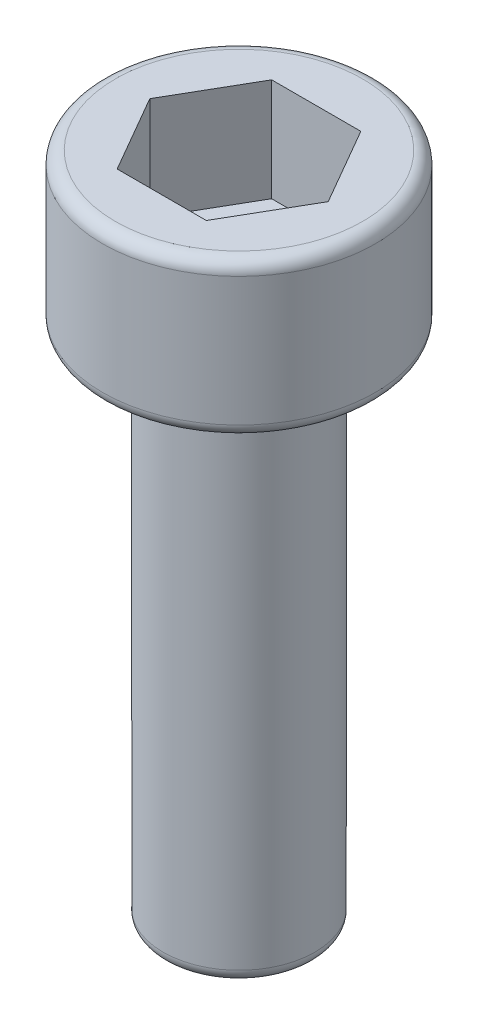
ISO-10303-21;
HEADER;
FILE_DESCRIPTION(('STEP AP214'),'2;1');
FILE_NAME('part.step','',(''),(''),'','','');
FILE_SCHEMA(('AUTOMOTIVE_DESIGN { 1 0 10303 214 1 1 1 1 }'));
ENDSEC;
DATA;
#1=APPLICATION_CONTEXT('core data for automotive mechanical design processes');
#2=APPLICATION_PROTOCOL_DEFINITION('international standard','automotive_design',2000,#1);
#3=PRODUCT_CONTEXT('',#1,'mechanical');
#4=PRODUCT('Part','Part','',(#3));
#5=PRODUCT_RELATED_PRODUCT_CATEGORY('part','',(#4));
#6=PRODUCT_DEFINITION_FORMATION('','',#4);
#7=PRODUCT_DEFINITION_CONTEXT('part definition',#1,'design');
#8=PRODUCT_DEFINITION('design','',#6,#7);
#9=PRODUCT_DEFINITION_SHAPE('','',#8);
#10=(LENGTH_UNIT() NAMED_UNIT(*) SI_UNIT(.MILLI.,.METRE.));
#11=(NAMED_UNIT(*) PLANE_ANGLE_UNIT() SI_UNIT($,.RADIAN.));
#12=(NAMED_UNIT(*) SI_UNIT($,.STERADIAN.) SOLID_ANGLE_UNIT());
#13=UNCERTAINTY_MEASURE_WITH_UNIT(LENGTH_MEASURE(1.E-05),#10,'distance_accuracy_value','');
#14=(GEOMETRIC_REPRESENTATION_CONTEXT(3) GLOBAL_UNCERTAINTY_ASSIGNED_CONTEXT((#13)) GLOBAL_UNIT_ASSIGNED_CONTEXT((#10,
#11,#12)) REPRESENTATION_CONTEXT('',''));
#15=CARTESIAN_POINT('',(0.,0.,0.));
#16=DIRECTION('',(0.,0.,1.));
#17=DIRECTION('',(1.,0.,0.));
#18=AXIS2_PLACEMENT_3D('',#15,#16,#17);
#19=CARTESIAN_POINT('',(0.,3.,0.));
#20=DIRECTION('',(0.,-1.,0.));
#21=DIRECTION('',(0.,0.,-1.));
#22=AXIS2_PLACEMENT_3D('',#19,#20,#21);
#23=CYLINDRICAL_SURFACE('',#22,2.65);
#24=CARTESIAN_POINT('',(0.,2.75,0.));
#25=DIRECTION('',(0.,1.,0.));
#26=DIRECTION('',(0.,0.,1.));
#27=AXIS2_PLACEMENT_3D('',#24,#25,#26);
#28=CIRCLE('',#27,2.65);
#29=CARTESIAN_POINT('',(0.,2.75,2.65));
#30=VERTEX_POINT('',#29);
#31=EDGE_CURVE('E41',#30,#30,#28,.F.);
#32=ORIENTED_EDGE('',*,*,#31,.T.);
#33=EDGE_LOOP('',(#32));
#34=FACE_BOUND('',#33,.T.);
#35=CARTESIAN_POINT('',(0.,0.25,0.));
#36=DIRECTION('',(0.,1.,0.));
#37=DIRECTION('',(0.,0.,1.));
#38=AXIS2_PLACEMENT_3D('',#35,#36,#37);
#39=CIRCLE('',#38,2.65);
#40=CARTESIAN_POINT('',(0.,0.25,2.65));
#41=VERTEX_POINT('',#40);
#42=EDGE_CURVE('E152',#41,#41,#39,.T.);
#43=ORIENTED_EDGE('',*,*,#42,.T.);
#44=EDGE_LOOP('',(#43));
#45=FACE_BOUND('',#44,.T.);
#46=ADVANCED_FACE('F33',(#34,#45),#23,.T.);
#47=CARTESIAN_POINT('',(0.,3.,0.));
#48=DIRECTION('',(0.,1.,0.));
#49=DIRECTION('',(0.,0.,1.));
#50=AXIS2_PLACEMENT_3D('',#47,#48,#49);
#51=PLANE('',#50);
#52=DIRECTION('',(0.5,0.,-0.866025403784439));
#53=VECTOR('',#52,1.);
#54=CARTESIAN_POINT('',(0.866025403784437,3.,1.5));
#55=LINE('',#54,#53);
#56=CARTESIAN_POINT('',(0.866025403784437,3.,1.5));
#57=VERTEX_POINT('',#56);
#58=CARTESIAN_POINT('',(1.73205080756888,3.,0.));
#59=VERTEX_POINT('',#58);
#60=EDGE_CURVE('E48',#57,#59,#55,.T.);
#61=ORIENTED_EDGE('',*,*,#60,.F.);
#62=DIRECTION('',(1.,0.,0.));
#63=VECTOR('',#62,1.);
#64=CARTESIAN_POINT('',(-0.86602540378444,3.,1.5));
#65=LINE('',#64,#63);
#66=CARTESIAN_POINT('',(-0.86602540378444,3.,1.5));
#67=VERTEX_POINT('',#66);
#68=EDGE_CURVE('E131',#67,#57,#65,.T.);
#69=ORIENTED_EDGE('',*,*,#68,.F.);
#70=DIRECTION('',(0.5,0.,0.866025403784439));
#71=VECTOR('',#70,1.);
#72=CARTESIAN_POINT('',(-1.73205080756888,3.,0.));
#73=LINE('',#72,#71);
#74=CARTESIAN_POINT('',(-1.73205080756888,3.,0.));
#75=VERTEX_POINT('',#74);
#76=EDGE_CURVE('E129',#75,#67,#73,.T.);
#77=ORIENTED_EDGE('',*,*,#76,.F.);
#78=DIRECTION('',(-0.5,0.,0.866025403784438));
#79=VECTOR('',#78,1.);
#80=CARTESIAN_POINT('',(-0.86602540378444,3.,-1.5));
#81=LINE('',#80,#79);
#82=CARTESIAN_POINT('',(-0.86602540378444,3.,-1.5));
#83=VERTEX_POINT('',#82);
#84=EDGE_CURVE('E96',#83,#75,#81,.T.);
#85=ORIENTED_EDGE('',*,*,#84,.F.);
#86=DIRECTION('',(-1.,0.,0.));
#87=VECTOR('',#86,1.);
#88=CARTESIAN_POINT('',(0.866025403784437,3.,-1.5));
#89=LINE('',#88,#87);
#90=CARTESIAN_POINT('',(0.866025403784437,3.,-1.5));
#91=VERTEX_POINT('',#90);
#92=EDGE_CURVE('E125',#91,#83,#89,.T.);
#93=ORIENTED_EDGE('',*,*,#92,.F.);
#94=DIRECTION('',(-0.5,0.,-0.866025403784438));
#95=VECTOR('',#94,1.);
#96=CARTESIAN_POINT('',(1.73205080756888,3.,0.));
#97=LINE('',#96,#95);
#98=EDGE_CURVE('E122',#59,#91,#97,.T.);
#99=ORIENTED_EDGE('',*,*,#98,.F.);
#100=EDGE_LOOP('',(#61,#69,#77,#85,#93,#99));
#101=FACE_BOUND('',#100,.T.);
#102=CARTESIAN_POINT('',(0.,3.,0.));
#103=DIRECTION('',(0.,1.,0.));
#104=DIRECTION('',(0.,0.,1.));
#105=AXIS2_PLACEMENT_3D('',#102,#103,#104);
#106=CIRCLE('',#105,2.4);
#107=CARTESIAN_POINT('',(0.,3.,2.4));
#108=VERTEX_POINT('',#107);
#109=EDGE_CURVE('E149',#108,#108,#106,.T.);
#110=ORIENTED_EDGE('',*,*,#109,.T.);
#111=EDGE_LOOP('',(#110));
#112=FACE_BOUND('',#111,.T.);
#113=ADVANCED_FACE('F165',(#101,#112),#51,.T.);
#114=CARTESIAN_POINT('',(0.,0.,0.));
#115=DIRECTION('',(0.,1.,0.));
#116=DIRECTION('',(0.,0.,1.));
#117=AXIS2_PLACEMENT_3D('',#114,#115,#116);
#118=PLANE('',#117);
#119=CARTESIAN_POINT('',(0.,0.,0.));
#120=DIRECTION('',(0.,1.,0.));
#121=DIRECTION('',(0.,0.,1.));
#122=AXIS2_PLACEMENT_3D('',#119,#120,#121);
#123=CIRCLE('',#122,2.4);
#124=CARTESIAN_POINT('',(0.,0.,2.4));
#125=VERTEX_POINT('',#124);
#126=EDGE_CURVE('E11',#125,#125,#123,.F.);
#127=ORIENTED_EDGE('',*,*,#126,.T.);
#128=EDGE_LOOP('',(#127));
#129=FACE_BOUND('',#128,.T.);
#130=CARTESIAN_POINT('',(0.,0.,0.));
#131=DIRECTION('',(0.,1.,0.));
#132=DIRECTION('',(0.,0.,1.));
#133=AXIS2_PLACEMENT_3D('',#130,#131,#132);
#134=CIRCLE('',#133,1.475);
#135=CARTESIAN_POINT('',(0.,0.,1.475));
#136=VERTEX_POINT('',#135);
#137=EDGE_CURVE('E135',#136,#136,#134,.F.);
#138=ORIENTED_EDGE('',*,*,#137,.F.);
#139=EDGE_LOOP('',(#138));
#140=FACE_BOUND('',#139,.T.);
#141=ADVANCED_FACE('F167',(#129,#140),#118,.F.);
#142=CARTESIAN_POINT('',(0.,-10.,0.));
#143=DIRECTION('',(0.,1.,0.));
#144=DIRECTION('',(0.,0.,1.));
#145=AXIS2_PLACEMENT_3D('',#142,#143,#144);
#146=CYLINDRICAL_SURFACE('',#145,1.475);
#147=CARTESIAN_POINT('',(0.,-9.75,0.));
#148=DIRECTION('',(0.,-1.,0.));
#149=DIRECTION('',(0.,0.,-1.));
#150=AXIS2_PLACEMENT_3D('',#147,#148,#149);
#151=CIRCLE('',#150,1.475);
#152=CARTESIAN_POINT('',(0.,-9.75,-1.475));
#153=VERTEX_POINT('',#152);
#154=EDGE_CURVE('E146',#153,#153,#151,.F.);
#155=ORIENTED_EDGE('',*,*,#154,.T.);
#156=EDGE_LOOP('',(#155));
#157=FACE_BOUND('',#156,.T.);
#158=ORIENTED_EDGE('',*,*,#137,.T.);
#159=EDGE_LOOP('',(#158));
#160=FACE_BOUND('',#159,.T.);
#161=ADVANCED_FACE('F174',(#157,#160),#146,.T.);
#162=CARTESIAN_POINT('',(0.,-10.,0.));
#163=DIRECTION('',(0.,-1.,0.));
#164=DIRECTION('',(0.,0.,-1.));
#165=AXIS2_PLACEMENT_3D('',#162,#163,#164);
#166=PLANE('',#165);
#167=CARTESIAN_POINT('',(0.,-10.,0.));
#168=DIRECTION('',(0.,-1.,0.));
#169=DIRECTION('',(0.,0.,-1.));
#170=AXIS2_PLACEMENT_3D('',#167,#168,#169);
#171=CIRCLE('',#170,1.225);
#172=CARTESIAN_POINT('',(0.,-10.,-1.225));
#173=VERTEX_POINT('',#172);
#174=EDGE_CURVE('E143',#173,#173,#171,.T.);
#175=ORIENTED_EDGE('',*,*,#174,.T.);
#176=EDGE_LOOP('',(#175));
#177=FACE_BOUND('',#176,.T.);
#178=ADVANCED_FACE('F182',(#177),#166,.T.);
#179=CARTESIAN_POINT('',(0.,-9.75,0.));
#180=DIRECTION('',(0.,-1.,0.));
#181=DIRECTION('',(0.,0.,-1.));
#182=AXIS2_PLACEMENT_3D('',#179,#180,#181);
#183=TOROIDAL_SURFACE('',#182,1.225,0.25);
#184=ORIENTED_EDGE('',*,*,#154,.F.);
#185=EDGE_LOOP('',(#184));
#186=FACE_BOUND('',#185,.T.);
#187=ORIENTED_EDGE('',*,*,#174,.F.);
#188=EDGE_LOOP('',(#187));
#189=FACE_BOUND('',#188,.T.);
#190=ADVANCED_FACE('F162',(#186,#189),#183,.T.);
#191=CARTESIAN_POINT('',(0.,2.75,0.));
#192=DIRECTION('',(0.,1.,0.));
#193=DIRECTION('',(0.,0.,1.));
#194=AXIS2_PLACEMENT_3D('',#191,#192,#193);
#195=TOROIDAL_SURFACE('',#194,2.4,0.25);
#196=ORIENTED_EDGE('',*,*,#31,.F.);
#197=EDGE_LOOP('',(#196));
#198=FACE_BOUND('',#197,.T.);
#199=ORIENTED_EDGE('',*,*,#109,.F.);
#200=EDGE_LOOP('',(#199));
#201=FACE_BOUND('',#200,.T.);
#202=ADVANCED_FACE('F159',(#198,#201),#195,.T.);
#203=CARTESIAN_POINT('',(0.,0.25,0.));
#204=DIRECTION('',(0.,1.,0.));
#205=DIRECTION('',(0.,0.,1.));
#206=AXIS2_PLACEMENT_3D('',#203,#204,#205);
#207=TOROIDAL_SURFACE('',#206,2.4,0.25);
#208=ORIENTED_EDGE('',*,*,#126,.F.);
#209=EDGE_LOOP('',(#208));
#210=FACE_BOUND('',#209,.T.);
#211=ORIENTED_EDGE('',*,*,#42,.F.);
#212=EDGE_LOOP('',(#211));
#213=FACE_BOUND('',#212,.T.);
#214=ADVANCED_FACE('F35',(#210,#213),#207,.T.);
#215=CARTESIAN_POINT('',(0.866025403784437,1.,1.5));
#216=DIRECTION('',(0.866025403784439,0.,0.5));
#217=DIRECTION('',(0.5,0.,-0.866025403784439));
#218=AXIS2_PLACEMENT_3D('',#215,#216,#217);
#219=PLANE('',#218);
#220=ORIENTED_EDGE('',*,*,#60,.T.);
#221=DIRECTION('',(0.,1.,0.));
#222=VECTOR('',#221,1.);
#223=CARTESIAN_POINT('',(1.73205080756888,1.,0.));
#224=LINE('',#223,#222);
#225=CARTESIAN_POINT('',(1.73205080756888,1.,0.));
#226=VERTEX_POINT('',#225);
#227=EDGE_CURVE('E78',#226,#59,#224,.T.);
#228=ORIENTED_EDGE('',*,*,#227,.F.);
#229=DIRECTION('',(0.5,0.,-0.866025403784439));
#230=VECTOR('',#229,1.);
#231=CARTESIAN_POINT('',(0.866025403784437,1.,1.5));
#232=LINE('',#231,#230);
#233=CARTESIAN_POINT('',(0.866025403784437,1.,1.5));
#234=VERTEX_POINT('',#233);
#235=EDGE_CURVE('E133',#234,#226,#232,.T.);
#236=ORIENTED_EDGE('',*,*,#235,.F.);
#237=DIRECTION('',(0.,1.,0.));
#238=VECTOR('',#237,1.);
#239=CARTESIAN_POINT('',(0.866025403784437,1.,1.5));
#240=LINE('',#239,#238);
#241=EDGE_CURVE('E56',#234,#57,#240,.T.);
#242=ORIENTED_EDGE('',*,*,#241,.T.);
#243=EDGE_LOOP('',(#220,#228,#236,#242));
#244=FACE_BOUND('',#243,.T.);
#245=ADVANCED_FACE('F222',(#244),#219,.F.);
#246=CARTESIAN_POINT('',(-0.86602540378444,1.,1.5));
#247=DIRECTION('',(0.,0.,1.));
#248=DIRECTION('',(1.,0.,0.));
#249=AXIS2_PLACEMENT_3D('',#246,#247,#248);
#250=PLANE('',#249);
#251=ORIENTED_EDGE('',*,*,#68,.T.);
#252=ORIENTED_EDGE('',*,*,#241,.F.);
#253=DIRECTION('',(1.,0.,0.));
#254=VECTOR('',#253,1.);
#255=CARTESIAN_POINT('',(-0.86602540378444,1.,1.5));
#256=LINE('',#255,#254);
#257=CARTESIAN_POINT('',(-0.86602540378444,1.,1.5));
#258=VERTEX_POINT('',#257);
#259=EDGE_CURVE('E108',#258,#234,#256,.T.);
#260=ORIENTED_EDGE('',*,*,#259,.F.);
#261=DIRECTION('',(0.,1.,0.));
#262=VECTOR('',#261,1.);
#263=CARTESIAN_POINT('',(-0.86602540378444,1.,1.5));
#264=LINE('',#263,#262);
#265=EDGE_CURVE('E100',#258,#67,#264,.T.);
#266=ORIENTED_EDGE('',*,*,#265,.T.);
#267=EDGE_LOOP('',(#251,#252,#260,#266));
#268=FACE_BOUND('',#267,.T.);
#269=ADVANCED_FACE('F238',(#268),#250,.F.);
#270=CARTESIAN_POINT('',(-1.73205080756888,1.,0.));
#271=DIRECTION('',(-0.866025403784439,0.,0.5));
#272=DIRECTION('',(0.5,0.,0.866025403784439));
#273=AXIS2_PLACEMENT_3D('',#270,#271,#272);
#274=PLANE('',#273);
#275=ORIENTED_EDGE('',*,*,#76,.T.);
#276=ORIENTED_EDGE('',*,*,#265,.F.);
#277=DIRECTION('',(0.5,0.,0.866025403784439));
#278=VECTOR('',#277,1.);
#279=CARTESIAN_POINT('',(-1.73205080756888,1.,0.));
#280=LINE('',#279,#278);
#281=CARTESIAN_POINT('',(-1.73205080756888,1.,0.));
#282=VERTEX_POINT('',#281);
#283=EDGE_CURVE('E104',#282,#258,#280,.T.);
#284=ORIENTED_EDGE('',*,*,#283,.F.);
#285=DIRECTION('',(0.,1.,0.));
#286=VECTOR('',#285,1.);
#287=CARTESIAN_POINT('',(-1.73205080756888,1.,0.));
#288=LINE('',#287,#286);
#289=EDGE_CURVE('E89',#282,#75,#288,.T.);
#290=ORIENTED_EDGE('',*,*,#289,.T.);
#291=EDGE_LOOP('',(#275,#276,#284,#290));
#292=FACE_BOUND('',#291,.T.);
#293=ADVANCED_FACE('F105',(#292),#274,.F.);
#294=CARTESIAN_POINT('',(-0.86602540378444,1.,-1.5));
#295=DIRECTION('',(-0.866025403784439,0.,-0.5));
#296=DIRECTION('',(-0.5,0.,0.866025403784438));
#297=AXIS2_PLACEMENT_3D('',#294,#295,#296);
#298=PLANE('',#297);
#299=ORIENTED_EDGE('',*,*,#84,.T.);
#300=ORIENTED_EDGE('',*,*,#289,.F.);
#301=DIRECTION('',(-0.5,0.,0.866025403784438));
#302=VECTOR('',#301,1.);
#303=CARTESIAN_POINT('',(-0.86602540378444,1.,-1.5));
#304=LINE('',#303,#302);
#305=CARTESIAN_POINT('',(-0.86602540378444,1.,-1.5));
#306=VERTEX_POINT('',#305);
#307=EDGE_CURVE('E93',#306,#282,#304,.T.);
#308=ORIENTED_EDGE('',*,*,#307,.F.);
#309=DIRECTION('',(0.,1.,0.));
#310=VECTOR('',#309,1.);
#311=CARTESIAN_POINT('',(-0.86602540378444,1.,-1.5));
#312=LINE('',#311,#310);
#313=EDGE_CURVE('E101',#306,#83,#312,.T.);
#314=ORIENTED_EDGE('',*,*,#313,.T.);
#315=EDGE_LOOP('',(#299,#300,#308,#314));
#316=FACE_BOUND('',#315,.T.);
#317=ADVANCED_FACE('F91',(#316),#298,.F.);
#318=CARTESIAN_POINT('',(0.866025403784437,1.,-1.5));
#319=DIRECTION('',(0.,0.,-1.));
#320=DIRECTION('',(-1.,0.,0.));
#321=AXIS2_PLACEMENT_3D('',#318,#319,#320);
#322=PLANE('',#321);
#323=ORIENTED_EDGE('',*,*,#92,.T.);
#324=ORIENTED_EDGE('',*,*,#313,.F.);
#325=DIRECTION('',(-1.,0.,0.));
#326=VECTOR('',#325,1.);
#327=CARTESIAN_POINT('',(0.866025403784437,1.,-1.5));
#328=LINE('',#327,#326);
#329=CARTESIAN_POINT('',(0.866025403784437,1.,-1.5));
#330=VERTEX_POINT('',#329);
#331=EDGE_CURVE('E114',#330,#306,#328,.T.);
#332=ORIENTED_EDGE('',*,*,#331,.F.);
#333=DIRECTION('',(0.,1.,0.));
#334=VECTOR('',#333,1.);
#335=CARTESIAN_POINT('',(0.866025403784437,1.,-1.5));
#336=LINE('',#335,#334);
#337=EDGE_CURVE('E138',#330,#91,#336,.T.);
#338=ORIENTED_EDGE('',*,*,#337,.T.);
#339=EDGE_LOOP('',(#323,#324,#332,#338));
#340=FACE_BOUND('',#339,.T.);
#341=ADVANCED_FACE('F263',(#340),#322,.F.);
#342=CARTESIAN_POINT('',(1.73205080756888,1.,0.));
#343=DIRECTION('',(0.866025403784438,0.,-0.5));
#344=DIRECTION('',(-0.5,0.,-0.866025403784439));
#345=AXIS2_PLACEMENT_3D('',#342,#343,#344);
#346=PLANE('',#345);
#347=ORIENTED_EDGE('',*,*,#98,.T.);
#348=ORIENTED_EDGE('',*,*,#337,.F.);
#349=DIRECTION('',(-0.5,0.,-0.866025403784438));
#350=VECTOR('',#349,1.);
#351=CARTESIAN_POINT('',(1.73205080756888,1.,0.));
#352=LINE('',#351,#350);
#353=EDGE_CURVE('E116',#226,#330,#352,.T.);
#354=ORIENTED_EDGE('',*,*,#353,.F.);
#355=ORIENTED_EDGE('',*,*,#227,.T.);
#356=EDGE_LOOP('',(#347,#348,#354,#355));
#357=FACE_BOUND('',#356,.T.);
#358=ADVANCED_FACE('F272',(#357),#346,.F.);
#359=CARTESIAN_POINT('',(0.,1.,0.));
#360=DIRECTION('',(0.,1.,0.));
#361=DIRECTION('',(0.,0.,1.));
#362=AXIS2_PLACEMENT_3D('',#359,#360,#361);
#363=PLANE('',#362);
#364=ORIENTED_EDGE('',*,*,#235,.T.);
#365=ORIENTED_EDGE('',*,*,#353,.T.);
#366=ORIENTED_EDGE('',*,*,#331,.T.);
#367=ORIENTED_EDGE('',*,*,#307,.T.);
#368=ORIENTED_EDGE('',*,*,#283,.T.);
#369=ORIENTED_EDGE('',*,*,#259,.T.);
#370=EDGE_LOOP('',(#364,#365,#366,#367,#368,#369));
#371=FACE_BOUND('',#370,.T.);
#372=ADVANCED_FACE('F111',(#371),#363,.T.);
#373=CLOSED_SHELL('',(#46,#113,#141,#161,#178,#190,#202,#214,#245,#269,#293,#317,#341,#358,#372));
#374=MANIFOLD_SOLID_BREP('B2',#373);
#375=ADVANCED_BREP_SHAPE_REPRESENTATION('',(#18,#374),#14);
#376=SHAPE_DEFINITION_REPRESENTATION(#9,#375);
ENDSEC;
END-ISO-10303-21;
